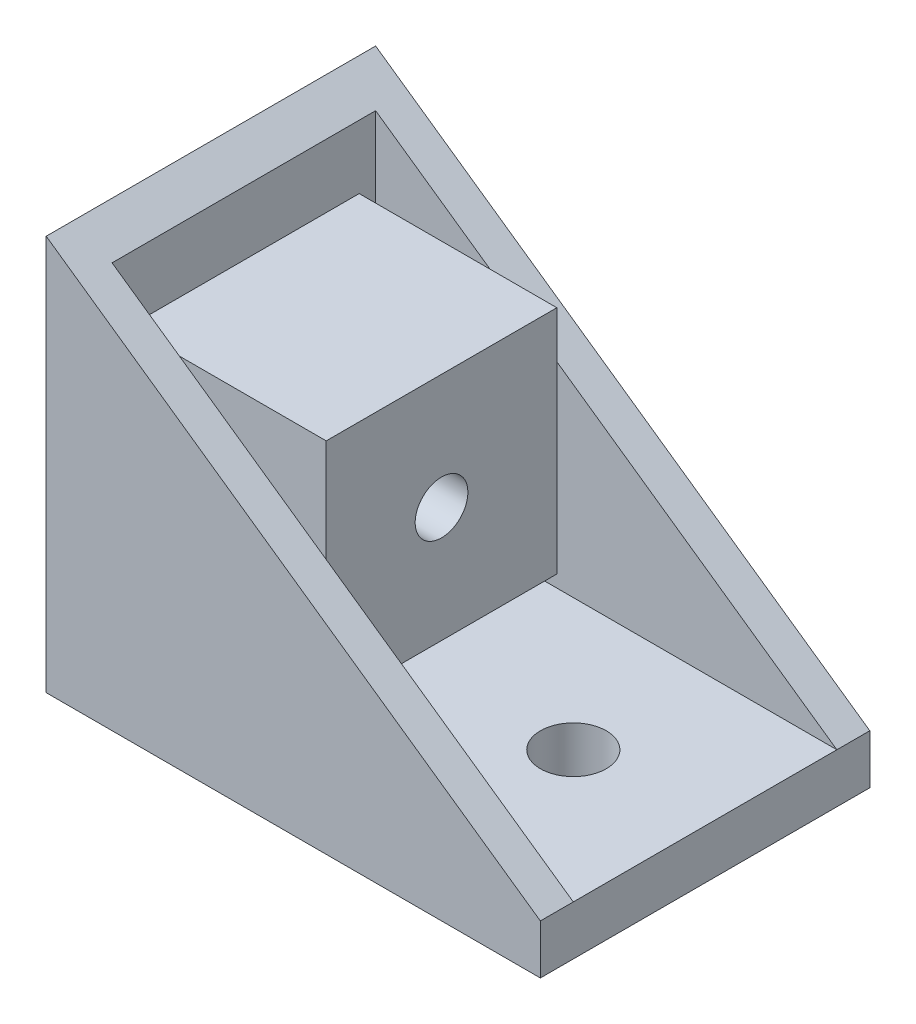
ISO-10303-21;
HEADER;
FILE_DESCRIPTION(('STEP AP214'),'2;1');
FILE_NAME('part.step','',(''),(''),'','','');
FILE_SCHEMA(('AUTOMOTIVE_DESIGN { 1 0 10303 214 1 1 1 1 }'));
ENDSEC;
DATA;
#1=APPLICATION_CONTEXT('core data for automotive mechanical design processes');
#2=APPLICATION_PROTOCOL_DEFINITION('international standard','automotive_design',2000,#1);
#3=PRODUCT_CONTEXT('',#1,'mechanical');
#4=PRODUCT('Part','Part','',(#3));
#5=PRODUCT_RELATED_PRODUCT_CATEGORY('part','',(#4));
#6=PRODUCT_DEFINITION_FORMATION('','',#4);
#7=PRODUCT_DEFINITION_CONTEXT('part definition',#1,'design');
#8=PRODUCT_DEFINITION('design','',#6,#7);
#9=PRODUCT_DEFINITION_SHAPE('','',#8);
#10=(LENGTH_UNIT() NAMED_UNIT(*) SI_UNIT(.MILLI.,.METRE.));
#11=(NAMED_UNIT(*) PLANE_ANGLE_UNIT() SI_UNIT($,.RADIAN.));
#12=(NAMED_UNIT(*) SI_UNIT($,.STERADIAN.) SOLID_ANGLE_UNIT());
#13=UNCERTAINTY_MEASURE_WITH_UNIT(LENGTH_MEASURE(1.E-05),#10,'distance_accuracy_value','');
#14=(GEOMETRIC_REPRESENTATION_CONTEXT(3) GLOBAL_UNCERTAINTY_ASSIGNED_CONTEXT((#13)) GLOBAL_UNIT_ASSIGNED_CONTEXT((#10,
#11,#12)) REPRESENTATION_CONTEXT('',''));
#15=CARTESIAN_POINT('',(0.,0.,0.));
#16=DIRECTION('',(0.,0.,1.));
#17=DIRECTION('',(1.,0.,0.));
#18=AXIS2_PLACEMENT_3D('',#15,#16,#17);
#19=CARTESIAN_POINT('',(-13.,24.,10.));
#20=DIRECTION('',(1.,0.,0.));
#21=DIRECTION('',(0.,0.,-1.));
#22=AXIS2_PLACEMENT_3D('',#19,#20,#21);
#23=PLANE('',#22);
#24=DIRECTION('',(0.,0.,1.));
#25=VECTOR('',#24,1.);
#26=CARTESIAN_POINT('',(-13.,3.,10.));
#27=LINE('',#26,#25);
#28=CARTESIAN_POINT('',(-13.,3.,-8.));
#29=VERTEX_POINT('',#28);
#30=CARTESIAN_POINT('',(-13.,3.,8.));
#31=VERTEX_POINT('',#30);
#32=EDGE_CURVE('E11',#29,#31,#27,.T.);
#33=ORIENTED_EDGE('',*,*,#32,.F.);
#34=DIRECTION('',(0.,-1.,0.));
#35=VECTOR('',#34,1.);
#36=CARTESIAN_POINT('',(-13.,24.,-8.));
#37=LINE('',#36,#35);
#38=CARTESIAN_POINT('',(-13.,22.6,-8.));
#39=VERTEX_POINT('',#38);
#40=EDGE_CURVE('E155',#39,#29,#37,.T.);
#41=ORIENTED_EDGE('',*,*,#40,.F.);
#42=DIRECTION('',(0.,0.,1.));
#43=VECTOR('',#42,1.);
#44=CARTESIAN_POINT('',(-13.,22.6,10.));
#45=LINE('',#44,#43);
#46=CARTESIAN_POINT('',(-13.,22.6,8.));
#47=VERTEX_POINT('',#46);
#48=EDGE_CURVE('E162',#39,#47,#45,.T.);
#49=ORIENTED_EDGE('',*,*,#48,.T.);
#50=DIRECTION('',(0.,-1.,0.));
#51=VECTOR('',#50,1.);
#52=CARTESIAN_POINT('',(-13.,24.,8.));
#53=LINE('',#52,#51);
#54=EDGE_CURVE('E159',#47,#31,#53,.T.);
#55=ORIENTED_EDGE('',*,*,#54,.T.);
#56=EDGE_LOOP('',(#33,#41,#49,#55));
#57=FACE_BOUND('',#56,.T.);
#58=DIRECTION('',(0.,0.,1.));
#59=VECTOR('',#58,1.);
#60=CARTESIAN_POINT('',(-13.,18.74,7.));
#61=LINE('',#60,#59);
#62=CARTESIAN_POINT('',(-13.,18.74,-7.));
#63=VERTEX_POINT('',#62);
#64=CARTESIAN_POINT('',(-13.,18.74,7.));
#65=VERTEX_POINT('',#64);
#66=EDGE_CURVE('E385',#63,#65,#61,.T.);
#67=ORIENTED_EDGE('',*,*,#66,.F.);
#68=DIRECTION('',(0.,1.,0.));
#69=VECTOR('',#68,1.);
#70=CARTESIAN_POINT('',(-13.,4.74,-7.));
#71=LINE('',#70,#69);
#72=CARTESIAN_POINT('',(-13.,4.74,-7.));
#73=VERTEX_POINT('',#72);
#74=EDGE_CURVE('E142',#73,#63,#71,.T.);
#75=ORIENTED_EDGE('',*,*,#74,.F.);
#76=DIRECTION('',(0.,0.,-1.));
#77=VECTOR('',#76,1.);
#78=CARTESIAN_POINT('',(-13.,4.74,7.));
#79=LINE('',#78,#77);
#80=CARTESIAN_POINT('',(-13.,4.74,7.));
#81=VERTEX_POINT('',#80);
#82=EDGE_CURVE('E138',#81,#73,#79,.T.);
#83=ORIENTED_EDGE('',*,*,#82,.F.);
#84=DIRECTION('',(0.,-1.,0.));
#85=VECTOR('',#84,1.);
#86=CARTESIAN_POINT('',(-13.,4.74,7.));
#87=LINE('',#86,#85);
#88=EDGE_CURVE('E383',#65,#81,#87,.T.);
#89=ORIENTED_EDGE('',*,*,#88,.F.);
#90=EDGE_LOOP('',(#67,#75,#83,#89));
#91=FACE_BOUND('',#90,.T.);
#92=ADVANCED_FACE('F34',(#57,#91),#23,.T.);
#93=CARTESIAN_POINT('',(6.34228187919463,9.06040268456376,-10.));
#94=DIRECTION('',(0.573462344363328,0.81923192051904,0.));
#95=DIRECTION('',(-0.81923192051904,0.573462344363328,0.));
#96=AXIS2_PLACEMENT_3D('',#93,#94,#95);
#97=PLANE('',#96);
#98=DIRECTION('',(0.,0.,1.));
#99=VECTOR('',#98,1.);
#100=CARTESIAN_POINT('',(15.,3.,-10.));
#101=LINE('',#100,#99);
#102=CARTESIAN_POINT('',(15.,3.,8.));
#103=VERTEX_POINT('',#102);
#104=CARTESIAN_POINT('',(15.,3.,10.));
#105=VERTEX_POINT('',#104);
#106=EDGE_CURVE('E170',#103,#105,#101,.T.);
#107=ORIENTED_EDGE('',*,*,#106,.F.);
#108=DIRECTION('',(-0.81923192051904,0.573462344363328,0.));
#109=VECTOR('',#108,1.);
#110=CARTESIAN_POINT('',(6.34228187919463,9.06040268456376,8.));
#111=LINE('',#110,#109);
#112=EDGE_CURVE('E152',#103,#47,#111,.T.);
#113=ORIENTED_EDGE('',*,*,#112,.T.);
#114=ORIENTED_EDGE('',*,*,#48,.F.);
#115=DIRECTION('',(-0.81923192051904,0.573462344363328,0.));
#116=VECTOR('',#115,1.);
#117=CARTESIAN_POINT('',(-15.,24.,-8.));
#118=LINE('',#117,#116);
#119=CARTESIAN_POINT('',(15.,3.,-8.));
#120=VERTEX_POINT('',#119);
#121=EDGE_CURVE('E163',#120,#39,#118,.T.);
#122=ORIENTED_EDGE('',*,*,#121,.F.);
#123=CARTESIAN_POINT('',(15.,3.,-10.));
#124=VERTEX_POINT('',#123);
#125=EDGE_CURVE('E173',#124,#120,#101,.T.);
#126=ORIENTED_EDGE('',*,*,#125,.F.);
#127=DIRECTION('',(-0.81923192051904,0.573462344363328,0.));
#128=VECTOR('',#127,1.);
#129=CARTESIAN_POINT('',(6.34228187919463,9.06040268456376,-10.));
#130=LINE('',#129,#128);
#131=CARTESIAN_POINT('',(-15.,24.,-10.));
#132=VERTEX_POINT('',#131);
#133=EDGE_CURVE('E168',#124,#132,#130,.T.);
#134=ORIENTED_EDGE('',*,*,#133,.T.);
#135=DIRECTION('',(0.,0.,1.));
#136=VECTOR('',#135,1.);
#137=CARTESIAN_POINT('',(-15.,24.,10.));
#138=LINE('',#137,#136);
#139=CARTESIAN_POINT('',(-15.,24.,10.));
#140=VERTEX_POINT('',#139);
#141=EDGE_CURVE('E177',#132,#140,#138,.T.);
#142=ORIENTED_EDGE('',*,*,#141,.T.);
#143=DIRECTION('',(-0.81923192051904,0.573462344363328,0.));
#144=VECTOR('',#143,1.);
#145=CARTESIAN_POINT('',(6.34228187919463,9.06040268456376,10.));
#146=LINE('',#145,#144);
#147=EDGE_CURVE('E158',#105,#140,#146,.T.);
#148=ORIENTED_EDGE('',*,*,#147,.F.);
#149=EDGE_LOOP('',(#107,#113,#114,#122,#126,#134,#142,#148));
#150=FACE_BOUND('',#149,.T.);
#151=ADVANCED_FACE('F218',(#150),#97,.T.);
#152=CARTESIAN_POINT('',(15.,24.,10.));
#153=DIRECTION('',(-1.,0.,0.));
#154=DIRECTION('',(0.,0.,1.));
#155=AXIS2_PLACEMENT_3D('',#152,#153,#154);
#156=PLANE('',#155);
#157=DIRECTION('',(0.,0.,-1.));
#158=VECTOR('',#157,1.);
#159=CARTESIAN_POINT('',(15.,0.,10.));
#160=LINE('',#159,#158);
#161=CARTESIAN_POINT('',(15.,0.,10.));
#162=VERTEX_POINT('',#161);
#163=CARTESIAN_POINT('',(15.,0.,-10.));
#164=VERTEX_POINT('',#163);
#165=EDGE_CURVE('E176',#162,#164,#160,.T.);
#166=ORIENTED_EDGE('',*,*,#165,.T.);
#167=DIRECTION('',(0.,-1.,0.));
#168=VECTOR('',#167,1.);
#169=CARTESIAN_POINT('',(15.,24.,-10.));
#170=LINE('',#169,#168);
#171=EDGE_CURVE('E43',#124,#164,#170,.T.);
#172=ORIENTED_EDGE('',*,*,#171,.F.);
#173=ORIENTED_EDGE('',*,*,#125,.T.);
#174=DIRECTION('',(0.,0.,-1.));
#175=VECTOR('',#174,1.);
#176=CARTESIAN_POINT('',(15.,3.,8.));
#177=LINE('',#176,#175);
#178=EDGE_CURVE('E144',#103,#120,#177,.T.);
#179=ORIENTED_EDGE('',*,*,#178,.F.);
#180=ORIENTED_EDGE('',*,*,#106,.T.);
#181=DIRECTION('',(0.,-1.,0.));
#182=VECTOR('',#181,1.);
#183=CARTESIAN_POINT('',(15.,24.,10.));
#184=LINE('',#183,#182);
#185=EDGE_CURVE('E179',#105,#162,#184,.T.);
#186=ORIENTED_EDGE('',*,*,#185,.T.);
#187=EDGE_LOOP('',(#166,#172,#173,#179,#180,#186));
#188=FACE_BOUND('',#187,.T.);
#189=ADVANCED_FACE('F36',(#188),#156,.F.);
#190=CARTESIAN_POINT('',(-15.,24.,-10.));
#191=DIRECTION('',(0.,0.,1.));
#192=DIRECTION('',(1.,0.,0.));
#193=AXIS2_PLACEMENT_3D('',#190,#191,#192);
#194=PLANE('',#193);
#195=ORIENTED_EDGE('',*,*,#133,.F.);
#196=ORIENTED_EDGE('',*,*,#171,.T.);
#197=DIRECTION('',(-1.,0.,0.));
#198=VECTOR('',#197,1.);
#199=CARTESIAN_POINT('',(-15.,0.,-10.));
#200=LINE('',#199,#198);
#201=CARTESIAN_POINT('',(-15.,0.,-10.));
#202=VERTEX_POINT('',#201);
#203=EDGE_CURVE('E182',#164,#202,#200,.T.);
#204=ORIENTED_EDGE('',*,*,#203,.T.);
#205=DIRECTION('',(0.,-1.,0.));
#206=VECTOR('',#205,1.);
#207=CARTESIAN_POINT('',(-15.,24.,-10.));
#208=LINE('',#207,#206);
#209=EDGE_CURVE('E192',#132,#202,#208,.T.);
#210=ORIENTED_EDGE('',*,*,#209,.F.);
#211=EDGE_LOOP('',(#195,#196,#204,#210));
#212=FACE_BOUND('',#211,.T.);
#213=ADVANCED_FACE('F200',(#212),#194,.F.);
#214=CARTESIAN_POINT('',(-15.,24.,10.));
#215=DIRECTION('',(0.,0.,-1.));
#216=DIRECTION('',(-1.,0.,0.));
#217=AXIS2_PLACEMENT_3D('',#214,#215,#216);
#218=PLANE('',#217);
#219=ORIENTED_EDGE('',*,*,#147,.T.);
#220=DIRECTION('',(0.,-1.,0.));
#221=VECTOR('',#220,1.);
#222=CARTESIAN_POINT('',(-15.,24.,10.));
#223=LINE('',#222,#221);
#224=CARTESIAN_POINT('',(-15.,0.,10.));
#225=VERTEX_POINT('',#224);
#226=EDGE_CURVE('E189',#140,#225,#223,.T.);
#227=ORIENTED_EDGE('',*,*,#226,.T.);
#228=DIRECTION('',(1.,0.,0.));
#229=VECTOR('',#228,1.);
#230=CARTESIAN_POINT('',(-15.,0.,10.));
#231=LINE('',#230,#229);
#232=EDGE_CURVE('E180',#225,#162,#231,.T.);
#233=ORIENTED_EDGE('',*,*,#232,.T.);
#234=ORIENTED_EDGE('',*,*,#185,.F.);
#235=EDGE_LOOP('',(#219,#227,#233,#234));
#236=FACE_BOUND('',#235,.T.);
#237=ADVANCED_FACE('F213',(#236),#218,.F.);
#238=CARTESIAN_POINT('',(-15.,24.,10.));
#239=DIRECTION('',(1.,0.,0.));
#240=DIRECTION('',(0.,0.,-1.));
#241=AXIS2_PLACEMENT_3D('',#238,#239,#240);
#242=PLANE('',#241);
#243=CARTESIAN_POINT('',(-15.,11.74,0.));
#244=DIRECTION('',(1.,0.,0.));
#245=DIRECTION('',(0.,0.,-1.));
#246=AXIS2_PLACEMENT_3D('',#243,#244,#245);
#247=CIRCLE('',#246,1.6);
#248=CARTESIAN_POINT('',(-15.,11.74,-1.6));
#249=VERTEX_POINT('',#248);
#250=EDGE_CURVE('E394',#249,#249,#247,.T.);
#251=ORIENTED_EDGE('',*,*,#250,.T.);
#252=EDGE_LOOP('',(#251));
#253=FACE_BOUND('',#252,.T.);
#254=DIRECTION('',(0.,0.,1.));
#255=VECTOR('',#254,1.);
#256=CARTESIAN_POINT('',(-15.,0.,10.));
#257=LINE('',#256,#255);
#258=EDGE_CURVE('E184',#202,#225,#257,.T.);
#259=ORIENTED_EDGE('',*,*,#258,.T.);
#260=ORIENTED_EDGE('',*,*,#226,.F.);
#261=ORIENTED_EDGE('',*,*,#141,.F.);
#262=ORIENTED_EDGE('',*,*,#209,.T.);
#263=EDGE_LOOP('',(#259,#260,#261,#262));
#264=FACE_BOUND('',#263,.T.);
#265=ADVANCED_FACE('F210',(#253,#264),#242,.F.);
#266=CARTESIAN_POINT('',(0.,0.,0.));
#267=DIRECTION('',(0.,-1.,0.));
#268=DIRECTION('',(0.,0.,-1.));
#269=AXIS2_PLACEMENT_3D('',#266,#267,#268);
#270=PLANE('',#269);
#271=CARTESIAN_POINT('',(6.99999999999999,0.,0.));
#272=DIRECTION('',(0.,-1.,0.));
#273=DIRECTION('',(0.,0.,-1.));
#274=AXIS2_PLACEMENT_3D('',#271,#272,#273);
#275=CIRCLE('',#274,2.);
#276=CARTESIAN_POINT('',(6.99999999999999,0.,-2.));
#277=VERTEX_POINT('',#276);
#278=EDGE_CURVE('E402',#277,#277,#275,.T.);
#279=ORIENTED_EDGE('',*,*,#278,.F.);
#280=EDGE_LOOP('',(#279));
#281=FACE_BOUND('',#280,.T.);
#282=ORIENTED_EDGE('',*,*,#232,.F.);
#283=ORIENTED_EDGE('',*,*,#258,.F.);
#284=ORIENTED_EDGE('',*,*,#203,.F.);
#285=ORIENTED_EDGE('',*,*,#165,.F.);
#286=EDGE_LOOP('',(#282,#283,#284,#285));
#287=FACE_BOUND('',#286,.T.);
#288=ADVANCED_FACE('F207',(#281,#287),#270,.T.);
#289=CARTESIAN_POINT('',(-15.,24.,-8.));
#290=DIRECTION('',(0.,0.,1.));
#291=DIRECTION('',(1.,0.,0.));
#292=AXIS2_PLACEMENT_3D('',#289,#290,#291);
#293=PLANE('',#292);
#294=ORIENTED_EDGE('',*,*,#40,.T.);
#295=DIRECTION('',(1.,0.,0.));
#296=VECTOR('',#295,1.);
#297=CARTESIAN_POINT('',(-9.00000000000001,3.,-8.));
#298=LINE('',#297,#296);
#299=EDGE_CURVE('E57',#29,#120,#298,.T.);
#300=ORIENTED_EDGE('',*,*,#299,.T.);
#301=ORIENTED_EDGE('',*,*,#121,.T.);
#302=EDGE_LOOP('',(#294,#300,#301));
#303=FACE_BOUND('',#302,.T.);
#304=ADVANCED_FACE('F229',(#303),#293,.T.);
#305=CARTESIAN_POINT('',(-15.,24.,8.));
#306=DIRECTION('',(0.,0.,-1.));
#307=DIRECTION('',(-1.,0.,0.));
#308=AXIS2_PLACEMENT_3D('',#305,#306,#307);
#309=PLANE('',#308);
#310=DIRECTION('',(1.,0.,0.));
#311=VECTOR('',#310,1.);
#312=CARTESIAN_POINT('',(-9.00000000000001,3.,8.));
#313=LINE('',#312,#311);
#314=EDGE_CURVE('E146',#31,#103,#313,.T.);
#315=ORIENTED_EDGE('',*,*,#314,.F.);
#316=ORIENTED_EDGE('',*,*,#54,.F.);
#317=ORIENTED_EDGE('',*,*,#112,.F.);
#318=EDGE_LOOP('',(#315,#316,#317));
#319=FACE_BOUND('',#318,.T.);
#320=ADVANCED_FACE('F224',(#319),#309,.T.);
#321=CARTESIAN_POINT('',(-9.00000000000001,3.,8.));
#322=DIRECTION('',(0.,-1.,0.));
#323=DIRECTION('',(0.,0.,-1.));
#324=AXIS2_PLACEMENT_3D('',#321,#322,#323);
#325=PLANE('',#324);
#326=CARTESIAN_POINT('',(6.99999999999999,3.,0.));
#327=DIRECTION('',(0.,-1.,0.));
#328=DIRECTION('',(0.,0.,-1.));
#329=AXIS2_PLACEMENT_3D('',#326,#327,#328);
#330=CIRCLE('',#329,2.);
#331=CARTESIAN_POINT('',(6.99999999999999,3.,-2.));
#332=VERTEX_POINT('',#331);
#333=EDGE_CURVE('E38',#332,#332,#330,.T.);
#334=ORIENTED_EDGE('',*,*,#333,.T.);
#335=EDGE_LOOP('',(#334));
#336=FACE_BOUND('',#335,.T.);
#337=ORIENTED_EDGE('',*,*,#299,.F.);
#338=ORIENTED_EDGE('',*,*,#32,.T.);
#339=ORIENTED_EDGE('',*,*,#314,.T.);
#340=ORIENTED_EDGE('',*,*,#178,.T.);
#341=EDGE_LOOP('',(#337,#338,#339,#340));
#342=FACE_BOUND('',#341,.T.);
#343=ADVANCED_FACE('F221',(#336,#342),#325,.F.);
#344=CARTESIAN_POINT('',(-1.,4.74,-7.));
#345=DIRECTION('',(0.,0.,1.));
#346=DIRECTION('',(1.,0.,0.));
#347=AXIS2_PLACEMENT_3D('',#344,#345,#346);
#348=PLANE('',#347);
#349=ORIENTED_EDGE('',*,*,#74,.T.);
#350=DIRECTION('',(-1.,0.,0.));
#351=VECTOR('',#350,1.);
#352=CARTESIAN_POINT('',(-1.,18.74,-7.));
#353=LINE('',#352,#351);
#354=CARTESIAN_POINT('',(-1.,18.74,-7.));
#355=VERTEX_POINT('',#354);
#356=EDGE_CURVE('E123',#355,#63,#353,.T.);
#357=ORIENTED_EDGE('',*,*,#356,.F.);
#358=DIRECTION('',(0.,1.,0.));
#359=VECTOR('',#358,1.);
#360=CARTESIAN_POINT('',(-1.,4.74,-7.));
#361=LINE('',#360,#359);
#362=CARTESIAN_POINT('',(-1.,4.74,-7.));
#363=VERTEX_POINT('',#362);
#364=EDGE_CURVE('E130',#363,#355,#361,.T.);
#365=ORIENTED_EDGE('',*,*,#364,.F.);
#366=DIRECTION('',(-1.,0.,0.));
#367=VECTOR('',#366,1.);
#368=CARTESIAN_POINT('',(-1.,4.74,-7.));
#369=LINE('',#368,#367);
#370=EDGE_CURVE('E390',#363,#73,#369,.T.);
#371=ORIENTED_EDGE('',*,*,#370,.T.);
#372=EDGE_LOOP('',(#349,#357,#365,#371));
#373=FACE_BOUND('',#372,.T.);
#374=ADVANCED_FACE('F140',(#373),#348,.F.);
#375=CARTESIAN_POINT('',(-1.,18.74,7.));
#376=DIRECTION('',(0.,-1.,0.));
#377=DIRECTION('',(0.,0.,-1.));
#378=AXIS2_PLACEMENT_3D('',#375,#376,#377);
#379=PLANE('',#378);
#380=ORIENTED_EDGE('',*,*,#66,.T.);
#381=DIRECTION('',(-1.,0.,0.));
#382=VECTOR('',#381,1.);
#383=CARTESIAN_POINT('',(-1.,18.74,7.));
#384=LINE('',#383,#382);
#385=CARTESIAN_POINT('',(-1.,18.74,7.));
#386=VERTEX_POINT('',#385);
#387=EDGE_CURVE('E126',#386,#65,#384,.T.);
#388=ORIENTED_EDGE('',*,*,#387,.F.);
#389=DIRECTION('',(0.,0.,1.));
#390=VECTOR('',#389,1.);
#391=CARTESIAN_POINT('',(-1.,18.74,7.));
#392=LINE('',#391,#390);
#393=EDGE_CURVE('E119',#355,#386,#392,.T.);
#394=ORIENTED_EDGE('',*,*,#393,.F.);
#395=ORIENTED_EDGE('',*,*,#356,.T.);
#396=EDGE_LOOP('',(#380,#388,#394,#395));
#397=FACE_BOUND('',#396,.T.);
#398=ADVANCED_FACE('F121',(#397),#379,.F.);
#399=CARTESIAN_POINT('',(-1.,4.74,7.));
#400=DIRECTION('',(0.,0.,-1.));
#401=DIRECTION('',(-1.,0.,0.));
#402=AXIS2_PLACEMENT_3D('',#399,#400,#401);
#403=PLANE('',#402);
#404=ORIENTED_EDGE('',*,*,#88,.T.);
#405=DIRECTION('',(-1.,0.,0.));
#406=VECTOR('',#405,1.);
#407=CARTESIAN_POINT('',(-1.,4.74,7.));
#408=LINE('',#407,#406);
#409=CARTESIAN_POINT('',(-1.,4.74,7.));
#410=VERTEX_POINT('',#409);
#411=EDGE_CURVE('E50',#410,#81,#408,.T.);
#412=ORIENTED_EDGE('',*,*,#411,.F.);
#413=DIRECTION('',(0.,-1.,0.));
#414=VECTOR('',#413,1.);
#415=CARTESIAN_POINT('',(-1.,4.74,7.));
#416=LINE('',#415,#414);
#417=EDGE_CURVE('E129',#386,#410,#416,.T.);
#418=ORIENTED_EDGE('',*,*,#417,.F.);
#419=ORIENTED_EDGE('',*,*,#387,.T.);
#420=EDGE_LOOP('',(#404,#412,#418,#419));
#421=FACE_BOUND('',#420,.T.);
#422=ADVANCED_FACE('F329',(#421),#403,.F.);
#423=CARTESIAN_POINT('',(-1.,4.74,7.));
#424=DIRECTION('',(0.,1.,0.));
#425=DIRECTION('',(0.,0.,1.));
#426=AXIS2_PLACEMENT_3D('',#423,#424,#425);
#427=PLANE('',#426);
#428=ORIENTED_EDGE('',*,*,#82,.T.);
#429=ORIENTED_EDGE('',*,*,#370,.F.);
#430=DIRECTION('',(0.,0.,-1.));
#431=VECTOR('',#430,1.);
#432=CARTESIAN_POINT('',(-1.,4.74,7.));
#433=LINE('',#432,#431);
#434=EDGE_CURVE('E134',#410,#363,#433,.T.);
#435=ORIENTED_EDGE('',*,*,#434,.F.);
#436=ORIENTED_EDGE('',*,*,#411,.T.);
#437=EDGE_LOOP('',(#428,#429,#435,#436));
#438=FACE_BOUND('',#437,.T.);
#439=ADVANCED_FACE('F322',(#438),#427,.F.);
#440=CARTESIAN_POINT('',(-1.,0.,0.));
#441=DIRECTION('',(-1.,0.,0.));
#442=DIRECTION('',(0.,0.,1.));
#443=AXIS2_PLACEMENT_3D('',#440,#441,#442);
#444=PLANE('',#443);
#445=CARTESIAN_POINT('',(-1.,11.74,0.));
#446=DIRECTION('',(1.,0.,0.));
#447=DIRECTION('',(0.,0.,-1.));
#448=AXIS2_PLACEMENT_3D('',#445,#446,#447);
#449=CIRCLE('',#448,1.6);
#450=CARTESIAN_POINT('',(-1.,11.74,-1.6));
#451=VERTEX_POINT('',#450);
#452=EDGE_CURVE('E396',#451,#451,#449,.T.);
#453=ORIENTED_EDGE('',*,*,#452,.F.);
#454=EDGE_LOOP('',(#453));
#455=FACE_BOUND('',#454,.T.);
#456=ORIENTED_EDGE('',*,*,#364,.T.);
#457=ORIENTED_EDGE('',*,*,#393,.T.);
#458=ORIENTED_EDGE('',*,*,#417,.T.);
#459=ORIENTED_EDGE('',*,*,#434,.T.);
#460=EDGE_LOOP('',(#456,#457,#458,#459));
#461=FACE_BOUND('',#460,.T.);
#462=ADVANCED_FACE('F133',(#455,#461),#444,.F.);
#463=CARTESIAN_POINT('',(-15.,11.74,0.));
#464=DIRECTION('',(1.,0.,0.));
#465=DIRECTION('',(0.,0.,-1.));
#466=AXIS2_PLACEMENT_3D('',#463,#464,#465);
#467=CYLINDRICAL_SURFACE('',#466,1.6);
#468=ORIENTED_EDGE('',*,*,#250,.F.);
#469=EDGE_LOOP('',(#468));
#470=FACE_BOUND('',#469,.T.);
#471=ORIENTED_EDGE('',*,*,#452,.T.);
#472=EDGE_LOOP('',(#471));
#473=FACE_BOUND('',#472,.T.);
#474=ADVANCED_FACE('F292',(#470,#473),#467,.F.);
#475=CARTESIAN_POINT('',(6.99999999999999,12.,0.));
#476=DIRECTION('',(0.,-1.,0.));
#477=DIRECTION('',(0.,0.,-1.));
#478=AXIS2_PLACEMENT_3D('',#475,#476,#477);
#479=CYLINDRICAL_SURFACE('',#478,2.);
#480=ORIENTED_EDGE('',*,*,#278,.T.);
#481=EDGE_LOOP('',(#480));
#482=FACE_BOUND('',#481,.T.);
#483=ORIENTED_EDGE('',*,*,#333,.F.);
#484=EDGE_LOOP('',(#483));
#485=FACE_BOUND('',#484,.T.);
#486=ADVANCED_FACE('F307',(#482,#485),#479,.F.);
#487=CLOSED_SHELL('',(#92,#151,#189,#213,#237,#265,#288,#304,#320,#343,#374,#398,#422,#439,#462,
#474,#486));
#488=MANIFOLD_SOLID_BREP('B2',#487);
#489=ADVANCED_BREP_SHAPE_REPRESENTATION('',(#18,#488),#14);
#490=SHAPE_DEFINITION_REPRESENTATION(#9,#489);
ENDSEC;
END-ISO-10303-21;
